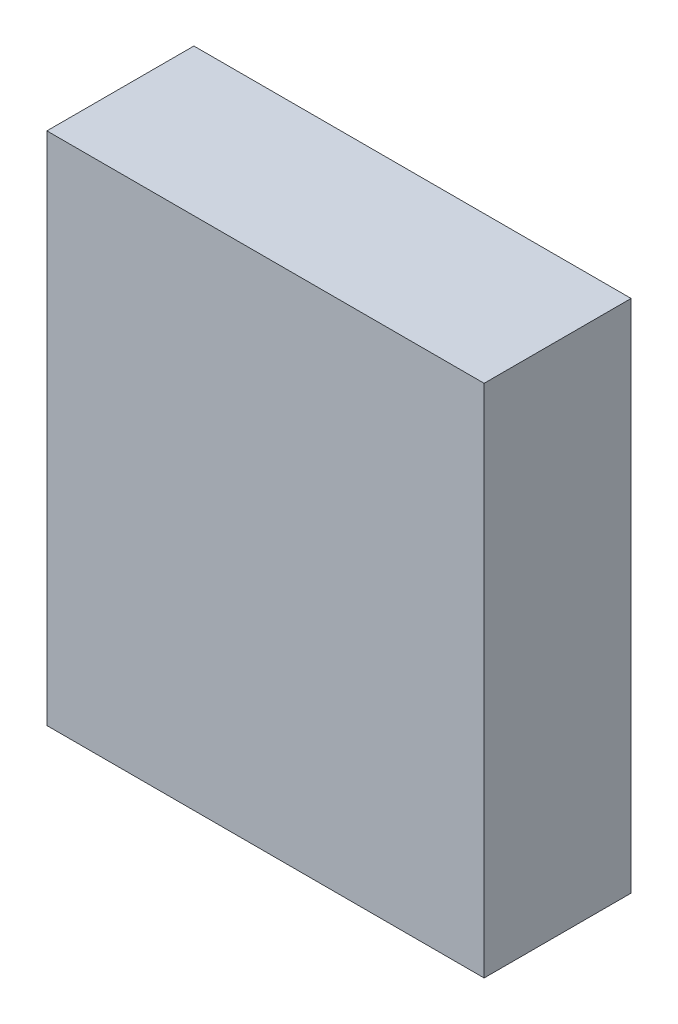
ISO-10303-21;
HEADER;
FILE_DESCRIPTION(('STEP AP214'),'2;1');
FILE_NAME('part.step','',(''),(''),'','','');
FILE_SCHEMA(('AUTOMOTIVE_DESIGN { 1 0 10303 214 1 1 1 1 }'));
ENDSEC;
DATA;
#1=APPLICATION_CONTEXT('core data for automotive mechanical design processes');
#2=APPLICATION_PROTOCOL_DEFINITION('international standard','automotive_design',2000,#1);
#3=PRODUCT_CONTEXT('',#1,'mechanical');
#4=PRODUCT('Part','Part','',(#3));
#5=PRODUCT_RELATED_PRODUCT_CATEGORY('part','',(#4));
#6=PRODUCT_DEFINITION_FORMATION('','',#4);
#7=PRODUCT_DEFINITION_CONTEXT('part definition',#1,'design');
#8=PRODUCT_DEFINITION('design','',#6,#7);
#9=PRODUCT_DEFINITION_SHAPE('','',#8);
#10=(LENGTH_UNIT() NAMED_UNIT(*) SI_UNIT(.MILLI.,.METRE.));
#11=(NAMED_UNIT(*) PLANE_ANGLE_UNIT() SI_UNIT($,.RADIAN.));
#12=(NAMED_UNIT(*) SI_UNIT($,.STERADIAN.) SOLID_ANGLE_UNIT());
#13=UNCERTAINTY_MEASURE_WITH_UNIT(LENGTH_MEASURE(1.E-05),#10,'distance_accuracy_value','');
#14=(GEOMETRIC_REPRESENTATION_CONTEXT(3) GLOBAL_UNCERTAINTY_ASSIGNED_CONTEXT((#13)) GLOBAL_UNIT_ASSIGNED_CONTEXT((#10,
#11,#12)) REPRESENTATION_CONTEXT('',''));
#15=CARTESIAN_POINT('',(0.,0.,0.));
#16=DIRECTION('',(0.,0.,1.));
#17=DIRECTION('',(1.,0.,0.));
#18=AXIS2_PLACEMENT_3D('',#15,#16,#17);
#19=CARTESIAN_POINT('',(0.677675,-0.63716,0.7));
#20=DIRECTION('',(0.,0.,1.));
#21=DIRECTION('',(1.,0.,0.));
#22=AXIS2_PLACEMENT_3D('',#19,#20,#21);
#23=PLANE('',#22);
#24=DIRECTION('',(1.,0.,0.));
#25=VECTOR('',#24,1.);
#26=CARTESIAN_POINT('',(-0.36347,-1.8636,0.7));
#27=LINE('',#26,#25);
#28=CARTESIAN_POINT('',(-0.36347,-1.8636,0.7));
#29=VERTEX_POINT('',#28);
#30=CARTESIAN_POINT('',(1.71882,-1.8636,0.7));
#31=VERTEX_POINT('',#30);
#32=EDGE_CURVE('E67',#29,#31,#27,.T.);
#33=ORIENTED_EDGE('',*,*,#32,.T.);
#34=DIRECTION('',(0.,1.,0.));
#35=VECTOR('',#34,1.);
#36=CARTESIAN_POINT('',(1.71882,-1.8636,0.7));
#37=LINE('',#36,#35);
#38=CARTESIAN_POINT('',(1.71882,0.58928,0.7));
#39=VERTEX_POINT('',#38);
#40=EDGE_CURVE('E90',#31,#39,#37,.T.);
#41=ORIENTED_EDGE('',*,*,#40,.T.);
#42=DIRECTION('',(-1.,0.,0.));
#43=VECTOR('',#42,1.);
#44=CARTESIAN_POINT('',(1.71882,0.58928,0.7));
#45=LINE('',#44,#43);
#46=CARTESIAN_POINT('',(-0.36347,0.58928,0.7));
#47=VERTEX_POINT('',#46);
#48=EDGE_CURVE('E69',#39,#47,#45,.T.);
#49=ORIENTED_EDGE('',*,*,#48,.T.);
#50=DIRECTION('',(0.,-1.,0.));
#51=VECTOR('',#50,1.);
#52=CARTESIAN_POINT('',(-0.36347,0.58928,0.7));
#53=LINE('',#52,#51);
#54=EDGE_CURVE('E11',#47,#29,#53,.T.);
#55=ORIENTED_EDGE('',*,*,#54,.T.);
#56=EDGE_LOOP('',(#33,#41,#49,#55));
#57=FACE_BOUND('',#56,.T.);
#58=ADVANCED_FACE('F16',(#57),#23,.T.);
#59=CARTESIAN_POINT('',(0.677675,-0.63716,0.));
#60=DIRECTION('',(0.,0.,1.));
#61=DIRECTION('',(1.,0.,0.));
#62=AXIS2_PLACEMENT_3D('',#59,#60,#61);
#63=PLANE('',#62);
#64=DIRECTION('',(1.,0.,0.));
#65=VECTOR('',#64,1.);
#66=CARTESIAN_POINT('',(-0.36347,-1.8636,0.));
#67=LINE('',#66,#65);
#68=CARTESIAN_POINT('',(-0.36347,-1.8636,0.));
#69=VERTEX_POINT('',#68);
#70=CARTESIAN_POINT('',(1.71882,-1.8636,0.));
#71=VERTEX_POINT('',#70);
#72=EDGE_CURVE('E83',#69,#71,#67,.T.);
#73=ORIENTED_EDGE('',*,*,#72,.F.);
#74=DIRECTION('',(0.,-1.,0.));
#75=VECTOR('',#74,1.);
#76=CARTESIAN_POINT('',(-0.36347,0.58928,0.));
#77=LINE('',#76,#75);
#78=CARTESIAN_POINT('',(-0.36347,0.58928,0.));
#79=VERTEX_POINT('',#78);
#80=EDGE_CURVE('E27',#79,#69,#77,.T.);
#81=ORIENTED_EDGE('',*,*,#80,.F.);
#82=DIRECTION('',(-1.,0.,0.));
#83=VECTOR('',#82,1.);
#84=CARTESIAN_POINT('',(1.71882,0.58928,0.));
#85=LINE('',#84,#83);
#86=CARTESIAN_POINT('',(1.71882,0.58928,0.));
#87=VERTEX_POINT('',#86);
#88=EDGE_CURVE('E99',#87,#79,#85,.T.);
#89=ORIENTED_EDGE('',*,*,#88,.F.);
#90=DIRECTION('',(0.,1.,0.));
#91=VECTOR('',#90,1.);
#92=CARTESIAN_POINT('',(1.71882,-1.8636,0.));
#93=LINE('',#92,#91);
#94=EDGE_CURVE('E78',#71,#87,#93,.T.);
#95=ORIENTED_EDGE('',*,*,#94,.F.);
#96=EDGE_LOOP('',(#73,#81,#89,#95));
#97=FACE_BOUND('',#96,.T.);
#98=ADVANCED_FACE('F125',(#97),#63,.F.);
#99=CARTESIAN_POINT('',(-0.36347,0.58928,0.));
#100=DIRECTION('',(1.,0.,0.));
#101=DIRECTION('',(0.,1.,0.));
#102=AXIS2_PLACEMENT_3D('',#99,#100,#101);
#103=PLANE('',#102);
#104=DIRECTION('',(0.,0.,1.));
#105=VECTOR('',#104,1.);
#106=CARTESIAN_POINT('',(-0.36347,0.58928,0.));
#107=LINE('',#106,#105);
#108=EDGE_CURVE('E96',#79,#47,#107,.T.);
#109=ORIENTED_EDGE('',*,*,#108,.F.);
#110=ORIENTED_EDGE('',*,*,#80,.T.);
#111=DIRECTION('',(0.,0.,1.));
#112=VECTOR('',#111,1.);
#113=CARTESIAN_POINT('',(-0.36347,-1.8636,0.));
#114=LINE('',#113,#112);
#115=EDGE_CURVE('E74',#69,#29,#114,.T.);
#116=ORIENTED_EDGE('',*,*,#115,.T.);
#117=ORIENTED_EDGE('',*,*,#54,.F.);
#118=EDGE_LOOP('',(#109,#110,#116,#117));
#119=FACE_BOUND('',#118,.T.);
#120=ADVANCED_FACE('F80',(#119),#103,.F.);
#121=CARTESIAN_POINT('',(1.71882,0.58928,0.));
#122=DIRECTION('',(0.,-1.,0.));
#123=DIRECTION('',(0.,0.,-1.));
#124=AXIS2_PLACEMENT_3D('',#121,#122,#123);
#125=PLANE('',#124);
#126=DIRECTION('',(0.,0.,1.));
#127=VECTOR('',#126,1.);
#128=CARTESIAN_POINT('',(1.71882,0.58928,0.));
#129=LINE('',#128,#127);
#130=EDGE_CURVE('E20',#87,#39,#129,.T.);
#131=ORIENTED_EDGE('',*,*,#130,.F.);
#132=ORIENTED_EDGE('',*,*,#88,.T.);
#133=ORIENTED_EDGE('',*,*,#108,.T.);
#134=ORIENTED_EDGE('',*,*,#48,.F.);
#135=EDGE_LOOP('',(#131,#132,#133,#134));
#136=FACE_BOUND('',#135,.T.);
#137=ADVANCED_FACE('F120',(#136),#125,.F.);
#138=CARTESIAN_POINT('',(1.71882,-1.8636,0.));
#139=DIRECTION('',(-1.,0.,0.));
#140=DIRECTION('',(0.,0.,1.));
#141=AXIS2_PLACEMENT_3D('',#138,#139,#140);
#142=PLANE('',#141);
#143=DIRECTION('',(0.,0.,1.));
#144=VECTOR('',#143,1.);
#145=CARTESIAN_POINT('',(1.71882,-1.8636,0.));
#146=LINE('',#145,#144);
#147=EDGE_CURVE('E76',#71,#31,#146,.T.);
#148=ORIENTED_EDGE('',*,*,#147,.F.);
#149=ORIENTED_EDGE('',*,*,#94,.T.);
#150=ORIENTED_EDGE('',*,*,#130,.T.);
#151=ORIENTED_EDGE('',*,*,#40,.F.);
#152=EDGE_LOOP('',(#148,#149,#150,#151));
#153=FACE_BOUND('',#152,.T.);
#154=ADVANCED_FACE('F118',(#153),#142,.F.);
#155=CARTESIAN_POINT('',(-0.36347,-1.8636,0.));
#156=DIRECTION('',(0.,1.,0.));
#157=DIRECTION('',(1.,0.,0.));
#158=AXIS2_PLACEMENT_3D('',#155,#156,#157);
#159=PLANE('',#158);
#160=ORIENTED_EDGE('',*,*,#115,.F.);
#161=ORIENTED_EDGE('',*,*,#72,.T.);
#162=ORIENTED_EDGE('',*,*,#147,.T.);
#163=ORIENTED_EDGE('',*,*,#32,.F.);
#164=EDGE_LOOP('',(#160,#161,#162,#163));
#165=FACE_BOUND('',#164,.T.);
#166=ADVANCED_FACE('F18',(#165),#159,.F.);
#167=CLOSED_SHELL('',(#58,#98,#120,#137,#154,#166));
#168=MANIFOLD_SOLID_BREP('B1',#167);
#169=ADVANCED_BREP_SHAPE_REPRESENTATION('',(#18,#168),#14);
#170=SHAPE_DEFINITION_REPRESENTATION(#9,#169);
ENDSEC;
END-ISO-10303-21;
